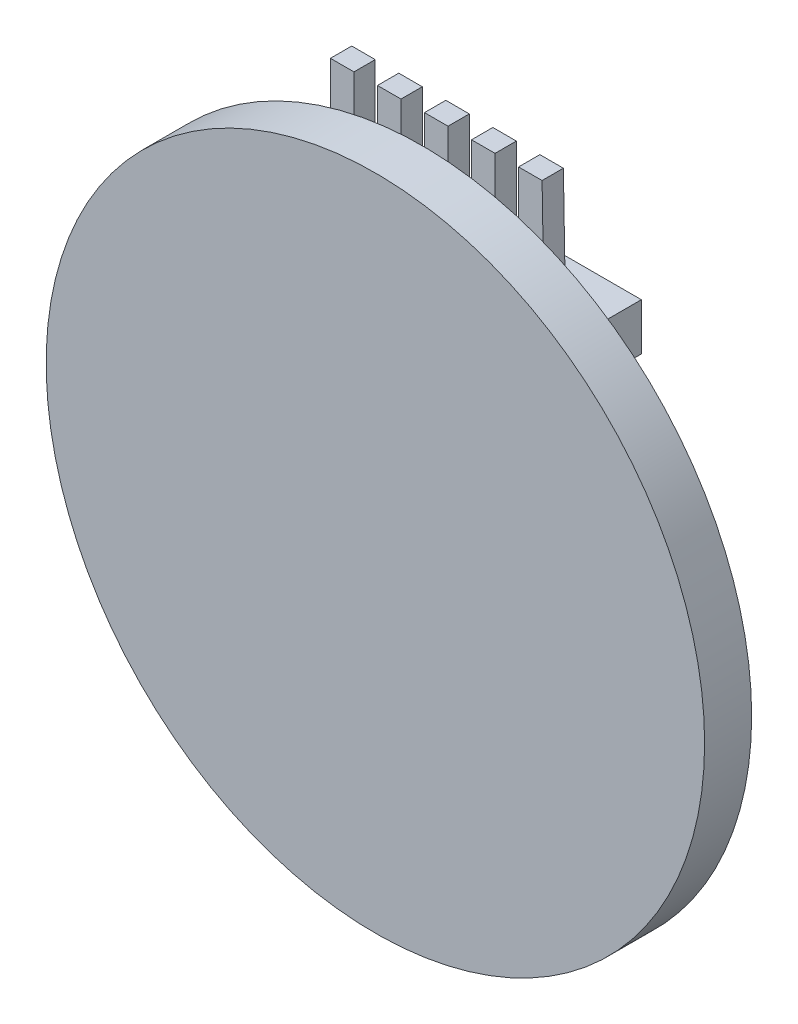
ISO-10303-21;
HEADER;
FILE_DESCRIPTION(('STEP AP214'),'2;1');
FILE_NAME('part.step','',(''),(''),'','','');
FILE_SCHEMA(('AUTOMOTIVE_DESIGN { 1 0 10303 214 1 1 1 1 }'));
ENDSEC;
DATA;
#1=APPLICATION_CONTEXT('core data for automotive mechanical design processes');
#2=APPLICATION_PROTOCOL_DEFINITION('international standard','automotive_design',2000,#1);
#3=PRODUCT_CONTEXT('',#1,'mechanical');
#4=PRODUCT('Part','Part','',(#3));
#5=PRODUCT_RELATED_PRODUCT_CATEGORY('part','',(#4));
#6=PRODUCT_DEFINITION_FORMATION('','',#4);
#7=PRODUCT_DEFINITION_CONTEXT('part definition',#1,'design');
#8=PRODUCT_DEFINITION('design','',#6,#7);
#9=PRODUCT_DEFINITION_SHAPE('','',#8);
#10=(LENGTH_UNIT() NAMED_UNIT(*) SI_UNIT(.MILLI.,.METRE.));
#11=(NAMED_UNIT(*) PLANE_ANGLE_UNIT() SI_UNIT($,.RADIAN.));
#12=(NAMED_UNIT(*) SI_UNIT($,.STERADIAN.) SOLID_ANGLE_UNIT());
#13=UNCERTAINTY_MEASURE_WITH_UNIT(LENGTH_MEASURE(1.E-05),#10,'distance_accuracy_value','');
#14=(GEOMETRIC_REPRESENTATION_CONTEXT(3) GLOBAL_UNCERTAINTY_ASSIGNED_CONTEXT((#13)) GLOBAL_UNIT_ASSIGNED_CONTEXT((#10,
#11,#12)) REPRESENTATION_CONTEXT('',''));
#15=CARTESIAN_POINT('',(0.,0.,0.));
#16=DIRECTION('',(0.,0.,1.));
#17=DIRECTION('',(1.,0.,0.));
#18=AXIS2_PLACEMENT_3D('',#15,#16,#17);
#19=CARTESIAN_POINT('',(2.6546441065011,4.49293382569431,-2.));
#20=DIRECTION('',(0.,-1.,0.));
#21=DIRECTION('',(0.,0.,-1.));
#22=AXIS2_PLACEMENT_3D('',#19,#20,#21);
#23=PLANE('',#22);
#24=DIRECTION('',(0.,0.,-1.));
#25=VECTOR('',#24,1.);
#26=CARTESIAN_POINT('',(-0.595355893498902,4.49293382569431,-0.139471022905013));
#27=LINE('',#26,#25);
#28=CARTESIAN_POINT('',(-0.595355893498902,4.49293382569431,-0.139471022905013));
#29=VERTEX_POINT('',#28);
#30=CARTESIAN_POINT('',(-0.595355893498902,4.49293382569431,-0.592294565038287));
#31=VERTEX_POINT('',#30);
#32=EDGE_CURVE('E190',#29,#31,#27,.T.);
#33=ORIENTED_EDGE('',*,*,#32,.F.);
#34=DIRECTION('',(1.,0.,0.));
#35=VECTOR('',#34,1.);
#36=CARTESIAN_POINT('',(-0.595355893498902,4.49293382569431,-0.139471022905013));
#37=LINE('',#36,#35);
#38=CARTESIAN_POINT('',(-1.0953558934989,4.49293382569431,-0.139471022905013));
#39=VERTEX_POINT('',#38);
#40=EDGE_CURVE('E195',#39,#29,#37,.T.);
#41=ORIENTED_EDGE('',*,*,#40,.F.);
#42=DIRECTION('',(0.,0.,1.));
#43=VECTOR('',#42,1.);
#44=CARTESIAN_POINT('',(-1.0953558934989,4.49293382569431,-0.139471022905013));
#45=LINE('',#44,#43);
#46=CARTESIAN_POINT('',(-1.0953558934989,4.49293382569431,-0.592294565038287));
#47=VERTEX_POINT('',#46);
#48=EDGE_CURVE('E210',#47,#39,#45,.T.);
#49=ORIENTED_EDGE('',*,*,#48,.F.);
#50=DIRECTION('',(-1.,0.,0.));
#51=VECTOR('',#50,1.);
#52=CARTESIAN_POINT('',(-0.595355893498902,4.49293382569431,-0.592294565038287));
#53=LINE('',#52,#51);
#54=EDGE_CURVE('E207',#31,#47,#53,.T.);
#55=ORIENTED_EDGE('',*,*,#54,.F.);
#56=EDGE_LOOP('',(#33,#41,#49,#55));
#57=FACE_BOUND('',#56,.T.);
#58=DIRECTION('',(0.,0.,-1.));
#59=VECTOR('',#58,1.);
#60=CARTESIAN_POINT('',(1.4046441065011,4.49293382569431,-0.139471022905013));
#61=LINE('',#60,#59);
#62=CARTESIAN_POINT('',(1.4046441065011,4.49293382569431,-0.139471022905013));
#63=VERTEX_POINT('',#62);
#64=CARTESIAN_POINT('',(1.4046441065011,4.49293382569431,-0.592294565038287));
#65=VERTEX_POINT('',#64);
#66=EDGE_CURVE('E262',#63,#65,#61,.T.);
#67=ORIENTED_EDGE('',*,*,#66,.F.);
#68=DIRECTION('',(1.,0.,0.));
#69=VECTOR('',#68,1.);
#70=CARTESIAN_POINT('',(1.4046441065011,4.49293382569431,-0.139471022905013));
#71=LINE('',#70,#69);
#72=CARTESIAN_POINT('',(0.904644106501098,4.49293382569431,-0.139471022905013));
#73=VERTEX_POINT('',#72);
#74=EDGE_CURVE('E266',#73,#63,#71,.T.);
#75=ORIENTED_EDGE('',*,*,#74,.F.);
#76=DIRECTION('',(0.,0.,1.));
#77=VECTOR('',#76,1.);
#78=CARTESIAN_POINT('',(0.904644106501098,4.49293382569431,-0.139471022905013));
#79=LINE('',#78,#77);
#80=CARTESIAN_POINT('',(0.904644106501098,4.49293382569431,-0.592294565038287));
#81=VERTEX_POINT('',#80);
#82=EDGE_CURVE('E278',#81,#73,#79,.T.);
#83=ORIENTED_EDGE('',*,*,#82,.F.);
#84=DIRECTION('',(-1.,0.,0.));
#85=VECTOR('',#84,1.);
#86=CARTESIAN_POINT('',(1.4046441065011,4.49293382569431,-0.592294565038287));
#87=LINE('',#86,#85);
#88=EDGE_CURVE('E275',#65,#81,#87,.T.);
#89=ORIENTED_EDGE('',*,*,#88,.F.);
#90=EDGE_LOOP('',(#67,#75,#83,#89));
#91=FACE_BOUND('',#90,.T.);
#92=DIRECTION('',(1.,0.,0.));
#93=VECTOR('',#92,1.);
#94=CARTESIAN_POINT('',(2.6546441065011,4.49293382569431,0.));
#95=LINE('',#94,#93);
#96=CARTESIAN_POINT('',(-2.3453558934989,4.49293382569431,0.));
#97=VERTEX_POINT('',#96);
#98=CARTESIAN_POINT('',(2.6546441065011,4.49293382569431,0.));
#99=VERTEX_POINT('',#98);
#100=EDGE_CURVE('E322',#97,#99,#95,.T.);
#101=ORIENTED_EDGE('',*,*,#100,.T.);
#102=DIRECTION('',(0.,0.,1.));
#103=VECTOR('',#102,1.);
#104=CARTESIAN_POINT('',(2.6546441065011,4.49293382569431,-2.));
#105=LINE('',#104,#103);
#106=CARTESIAN_POINT('',(2.6546441065011,4.49293382569431,-2.));
#107=VERTEX_POINT('',#106);
#108=EDGE_CURVE('E328',#107,#99,#105,.T.);
#109=ORIENTED_EDGE('',*,*,#108,.F.);
#110=DIRECTION('',(1.,0.,0.));
#111=VECTOR('',#110,1.);
#112=CARTESIAN_POINT('',(2.6546441065011,4.49293382569431,-2.));
#113=LINE('',#112,#111);
#114=CARTESIAN_POINT('',(-2.3453558934989,4.49293382569431,-2.));
#115=VERTEX_POINT('',#114);
#116=EDGE_CURVE('E326',#115,#107,#113,.T.);
#117=ORIENTED_EDGE('',*,*,#116,.F.);
#118=DIRECTION('',(0.,0.,1.));
#119=VECTOR('',#118,1.);
#120=CARTESIAN_POINT('',(-2.3453558934989,4.49293382569431,-2.));
#121=LINE('',#120,#119);
#122=EDGE_CURVE('E342',#115,#97,#121,.T.);
#123=ORIENTED_EDGE('',*,*,#122,.T.);
#124=EDGE_LOOP('',(#101,#109,#117,#123));
#125=FACE_BOUND('',#124,.T.);
#126=DIRECTION('',(0.,0.,1.));
#127=VECTOR('',#126,1.);
#128=CARTESIAN_POINT('',(2.45700930128575,4.49293382569431,-2.));
#129=LINE('',#128,#127);
#130=CARTESIAN_POINT('',(2.45700930128575,4.49293382569431,-0.139471022905013));
#131=VERTEX_POINT('',#130);
#132=CARTESIAN_POINT('',(2.45700930128575,4.49293382569431,-0.592294565038287));
#133=VERTEX_POINT('',#132);
#134=EDGE_CURVE('E69',#131,#133,#129,.F.);
#135=ORIENTED_EDGE('',*,*,#134,.F.);
#136=DIRECTION('',(1.,0.,0.));
#137=VECTOR('',#136,1.);
#138=CARTESIAN_POINT('',(2.4046441065011,4.49293382569431,-0.139471022905013));
#139=LINE('',#138,#137);
#140=CARTESIAN_POINT('',(1.9046441065011,4.49293382569431,-0.139471022905013));
#141=VERTEX_POINT('',#140);
#142=EDGE_CURVE('E298',#141,#131,#139,.T.);
#143=ORIENTED_EDGE('',*,*,#142,.F.);
#144=DIRECTION('',(0.,0.,1.));
#145=VECTOR('',#144,1.);
#146=CARTESIAN_POINT('',(1.9046441065011,4.49293382569431,-0.139471022905013));
#147=LINE('',#146,#145);
#148=CARTESIAN_POINT('',(1.9046441065011,4.49293382569431,-0.592294565038287));
#149=VERTEX_POINT('',#148);
#150=EDGE_CURVE('E308',#149,#141,#147,.T.);
#151=ORIENTED_EDGE('',*,*,#150,.F.);
#152=DIRECTION('',(-1.,0.,0.));
#153=VECTOR('',#152,1.);
#154=CARTESIAN_POINT('',(2.4046441065011,4.49293382569431,-0.592294565038287));
#155=LINE('',#154,#153);
#156=EDGE_CURVE('E305',#133,#149,#155,.T.);
#157=ORIENTED_EDGE('',*,*,#156,.F.);
#158=EDGE_LOOP('',(#135,#143,#151,#157));
#159=FACE_BOUND('',#158,.T.);
#160=DIRECTION('',(0.,0.,-1.));
#161=VECTOR('',#160,1.);
#162=CARTESIAN_POINT('',(0.404644106501098,4.49293382569431,-0.139471022905013));
#163=LINE('',#162,#161);
#164=CARTESIAN_POINT('',(0.404644106501098,4.49293382569431,-0.139471022905013));
#165=VERTEX_POINT('',#164);
#166=CARTESIAN_POINT('',(0.404644106501098,4.49293382569431,-0.592294565038287));
#167=VERTEX_POINT('',#166);
#168=EDGE_CURVE('E226',#165,#167,#163,.T.);
#169=ORIENTED_EDGE('',*,*,#168,.F.);
#170=DIRECTION('',(1.,0.,0.));
#171=VECTOR('',#170,1.);
#172=CARTESIAN_POINT('',(0.404644106501098,4.49293382569431,-0.139471022905013));
#173=LINE('',#172,#171);
#174=CARTESIAN_POINT('',(-0.0953558934989021,4.49293382569431,-0.139471022905013));
#175=VERTEX_POINT('',#174);
#176=EDGE_CURVE('E231',#175,#165,#173,.T.);
#177=ORIENTED_EDGE('',*,*,#176,.F.);
#178=DIRECTION('',(0.,0.,1.));
#179=VECTOR('',#178,1.);
#180=CARTESIAN_POINT('',(-0.0953558934989021,4.49293382569431,-0.139471022905013));
#181=LINE('',#180,#179);
#182=CARTESIAN_POINT('',(-0.0953558934989021,4.49293382569431,-0.592294565038287));
#183=VERTEX_POINT('',#182);
#184=EDGE_CURVE('E246',#183,#175,#181,.T.);
#185=ORIENTED_EDGE('',*,*,#184,.F.);
#186=DIRECTION('',(-1.,0.,0.));
#187=VECTOR('',#186,1.);
#188=CARTESIAN_POINT('',(0.404644106501098,4.49293382569431,-0.592294565038287));
#189=LINE('',#188,#187);
#190=EDGE_CURVE('E243',#167,#183,#189,.T.);
#191=ORIENTED_EDGE('',*,*,#190,.F.);
#192=EDGE_LOOP('',(#169,#177,#185,#191));
#193=FACE_BOUND('',#192,.T.);
#194=DIRECTION('',(0.,0.,-1.));
#195=VECTOR('',#194,1.);
#196=CARTESIAN_POINT('',(-1.5953558934989,4.49293382569431,-0.139471022905013));
#197=LINE('',#196,#195);
#198=CARTESIAN_POINT('',(-1.5953558934989,4.49293382569431,-0.139471022905013));
#199=VERTEX_POINT('',#198);
#200=CARTESIAN_POINT('',(-1.5953558934989,4.49293382569431,-0.592294565038287));
#201=VERTEX_POINT('',#200);
#202=EDGE_CURVE('E162',#199,#201,#197,.T.);
#203=ORIENTED_EDGE('',*,*,#202,.F.);
#204=DIRECTION('',(1.,0.,0.));
#205=VECTOR('',#204,1.);
#206=CARTESIAN_POINT('',(-1.5953558934989,4.49293382569431,-0.139471022905013));
#207=LINE('',#206,#205);
#208=CARTESIAN_POINT('',(-2.0953558934989,4.49293382569431,-0.139471022905013));
#209=VERTEX_POINT('',#208);
#210=EDGE_CURVE('E157',#209,#199,#207,.T.);
#211=ORIENTED_EDGE('',*,*,#210,.F.);
#212=DIRECTION('',(0.,0.,1.));
#213=VECTOR('',#212,1.);
#214=CARTESIAN_POINT('',(-2.0953558934989,4.49293382569431,-0.139471022905013));
#215=LINE('',#214,#213);
#216=CARTESIAN_POINT('',(-2.0953558934989,4.49293382569431,-0.592294565038287));
#217=VERTEX_POINT('',#216);
#218=EDGE_CURVE('E159',#217,#209,#215,.T.);
#219=ORIENTED_EDGE('',*,*,#218,.F.);
#220=DIRECTION('',(-1.,0.,0.));
#221=VECTOR('',#220,1.);
#222=CARTESIAN_POINT('',(-1.5953558934989,4.49293382569431,-0.592294565038287));
#223=LINE('',#222,#221);
#224=EDGE_CURVE('E56',#201,#217,#223,.T.);
#225=ORIENTED_EDGE('',*,*,#224,.F.);
#226=EDGE_LOOP('',(#203,#211,#219,#225));
#227=FACE_BOUND('',#226,.T.);
#228=ADVANCED_FACE('F37',(#57,#91,#125,#159,#193,#227),#23,.F.);
#229=CARTESIAN_POINT('',(0.,0.,0.));
#230=DIRECTION('',(0.,0.,1.));
#231=DIRECTION('',(1.,0.,0.));
#232=AXIS2_PLACEMENT_3D('',#229,#230,#231);
#233=PLANE('',#232);
#234=CARTESIAN_POINT('',(0.,0.,0.));
#235=DIRECTION('',(0.,0.,1.));
#236=DIRECTION('',(1.,0.,0.));
#237=AXIS2_PLACEMENT_3D('',#234,#235,#236);
#238=CIRCLE('',#237,7.);
#239=CARTESIAN_POINT('',(7.,0.,0.));
#240=VERTEX_POINT('',#239);
#241=EDGE_CURVE('E47',#240,#240,#238,.T.);
#242=ORIENTED_EDGE('',*,*,#241,.F.);
#243=EDGE_LOOP('',(#242));
#244=FACE_BOUND('',#243,.T.);
#245=DIRECTION('',(0.,-1.,0.));
#246=VECTOR('',#245,1.);
#247=CARTESIAN_POINT('',(2.6546441065011,4.49293382569431,0.));
#248=LINE('',#247,#246);
#249=CARTESIAN_POINT('',(2.6546441065011,3.49293382569431,0.));
#250=VERTEX_POINT('',#249);
#251=EDGE_CURVE('E329',#99,#250,#248,.T.);
#252=ORIENTED_EDGE('',*,*,#251,.F.);
#253=ORIENTED_EDGE('',*,*,#100,.F.);
#254=DIRECTION('',(0.,1.,0.));
#255=VECTOR('',#254,1.);
#256=CARTESIAN_POINT('',(-2.3453558934989,4.49293382569431,0.));
#257=LINE('',#256,#255);
#258=CARTESIAN_POINT('',(-2.3453558934989,3.49293382569431,0.));
#259=VERTEX_POINT('',#258);
#260=EDGE_CURVE('E335',#259,#97,#257,.T.);
#261=ORIENTED_EDGE('',*,*,#260,.F.);
#262=DIRECTION('',(-1.,0.,0.));
#263=VECTOR('',#262,1.);
#264=CARTESIAN_POINT('',(2.6546441065011,3.49293382569431,0.));
#265=LINE('',#264,#263);
#266=EDGE_CURVE('E332',#250,#259,#265,.T.);
#267=ORIENTED_EDGE('',*,*,#266,.F.);
#268=EDGE_LOOP('',(#252,#253,#261,#267));
#269=FACE_BOUND('',#268,.T.);
#270=ADVANCED_FACE('F384',(#244,#269),#233,.F.);
#271=CARTESIAN_POINT('',(0.,0.,1.));
#272=DIRECTION('',(0.,0.,-1.));
#273=DIRECTION('',(-1.,0.,0.));
#274=AXIS2_PLACEMENT_3D('',#271,#272,#273);
#275=CYLINDRICAL_SURFACE('',#274,7.);
#276=CARTESIAN_POINT('',(0.,0.,1.));
#277=DIRECTION('',(0.,0.,1.));
#278=DIRECTION('',(1.,0.,0.));
#279=AXIS2_PLACEMENT_3D('',#276,#277,#278);
#280=CIRCLE('',#279,7.);
#281=CARTESIAN_POINT('',(7.,0.,1.));
#282=VERTEX_POINT('',#281);
#283=EDGE_CURVE('E11',#282,#282,#280,.T.);
#284=ORIENTED_EDGE('',*,*,#283,.F.);
#285=EDGE_LOOP('',(#284));
#286=FACE_BOUND('',#285,.T.);
#287=ORIENTED_EDGE('',*,*,#241,.T.);
#288=EDGE_LOOP('',(#287));
#289=FACE_BOUND('',#288,.T.);
#290=ADVANCED_FACE('F390',(#286,#289),#275,.T.);
#291=CARTESIAN_POINT('',(0.,0.,1.));
#292=DIRECTION('',(0.,0.,1.));
#293=DIRECTION('',(1.,0.,0.));
#294=AXIS2_PLACEMENT_3D('',#291,#292,#293);
#295=PLANE('',#294);
#296=ORIENTED_EDGE('',*,*,#283,.T.);
#297=EDGE_LOOP('',(#296));
#298=FACE_BOUND('',#297,.T.);
#299=ADVANCED_FACE('F410',(#298),#295,.T.);
#300=CARTESIAN_POINT('',(2.6546441065011,4.49293382569431,-2.));
#301=DIRECTION('',(-1.,0.,0.));
#302=DIRECTION('',(0.,0.,1.));
#303=AXIS2_PLACEMENT_3D('',#300,#301,#302);
#304=PLANE('',#303);
#305=ORIENTED_EDGE('',*,*,#251,.T.);
#306=DIRECTION('',(0.,0.,1.));
#307=VECTOR('',#306,1.);
#308=CARTESIAN_POINT('',(2.6546441065011,3.49293382569431,-2.));
#309=LINE('',#308,#307);
#310=CARTESIAN_POINT('',(2.6546441065011,3.49293382569431,-2.));
#311=VERTEX_POINT('',#310);
#312=EDGE_CURVE('E348',#311,#250,#309,.T.);
#313=ORIENTED_EDGE('',*,*,#312,.F.);
#314=DIRECTION('',(0.,-1.,0.));
#315=VECTOR('',#314,1.);
#316=CARTESIAN_POINT('',(2.6546441065011,4.49293382569431,-2.));
#317=LINE('',#316,#315);
#318=EDGE_CURVE('E318',#107,#311,#317,.T.);
#319=ORIENTED_EDGE('',*,*,#318,.F.);
#320=ORIENTED_EDGE('',*,*,#108,.T.);
#321=EDGE_LOOP('',(#305,#313,#319,#320));
#322=FACE_BOUND('',#321,.T.);
#323=ADVANCED_FACE('F406',(#322),#304,.F.);
#324=CARTESIAN_POINT('',(2.6546441065011,3.49293382569431,-2.));
#325=DIRECTION('',(0.,1.,0.));
#326=DIRECTION('',(0.,0.,1.));
#327=AXIS2_PLACEMENT_3D('',#324,#325,#326);
#328=PLANE('',#327);
#329=ORIENTED_EDGE('',*,*,#266,.T.);
#330=DIRECTION('',(0.,0.,1.));
#331=VECTOR('',#330,1.);
#332=CARTESIAN_POINT('',(-2.3453558934989,3.49293382569431,-2.));
#333=LINE('',#332,#331);
#334=CARTESIAN_POINT('',(-2.3453558934989,3.49293382569431,-2.));
#335=VERTEX_POINT('',#334);
#336=EDGE_CURVE('E345',#335,#259,#333,.T.);
#337=ORIENTED_EDGE('',*,*,#336,.F.);
#338=DIRECTION('',(-1.,0.,0.));
#339=VECTOR('',#338,1.);
#340=CARTESIAN_POINT('',(2.6546441065011,3.49293382569431,-2.));
#341=LINE('',#340,#339);
#342=EDGE_CURVE('E321',#311,#335,#341,.T.);
#343=ORIENTED_EDGE('',*,*,#342,.F.);
#344=ORIENTED_EDGE('',*,*,#312,.T.);
#345=EDGE_LOOP('',(#329,#337,#343,#344));
#346=FACE_BOUND('',#345,.T.);
#347=ADVANCED_FACE('F402',(#346),#328,.F.);
#348=CARTESIAN_POINT('',(-2.3453558934989,4.49293382569431,-2.));
#349=DIRECTION('',(1.,0.,0.));
#350=DIRECTION('',(0.,0.,-1.));
#351=AXIS2_PLACEMENT_3D('',#348,#349,#350);
#352=PLANE('',#351);
#353=ORIENTED_EDGE('',*,*,#260,.T.);
#354=ORIENTED_EDGE('',*,*,#122,.F.);
#355=DIRECTION('',(0.,1.,0.));
#356=VECTOR('',#355,1.);
#357=CARTESIAN_POINT('',(-2.3453558934989,4.49293382569431,-2.));
#358=LINE('',#357,#356);
#359=EDGE_CURVE('E324',#335,#115,#358,.T.);
#360=ORIENTED_EDGE('',*,*,#359,.F.);
#361=ORIENTED_EDGE('',*,*,#336,.T.);
#362=EDGE_LOOP('',(#353,#354,#360,#361));
#363=FACE_BOUND('',#362,.T.);
#364=ADVANCED_FACE('F399',(#363),#352,.F.);
#365=CARTESIAN_POINT('',(0.,0.,-2.));
#366=DIRECTION('',(0.,0.,-1.));
#367=DIRECTION('',(-1.,0.,0.));
#368=AXIS2_PLACEMENT_3D('',#365,#366,#367);
#369=PLANE('',#368);
#370=ORIENTED_EDGE('',*,*,#318,.T.);
#371=ORIENTED_EDGE('',*,*,#342,.T.);
#372=ORIENTED_EDGE('',*,*,#359,.T.);
#373=ORIENTED_EDGE('',*,*,#116,.T.);
#374=EDGE_LOOP('',(#370,#371,#372,#373));
#375=FACE_BOUND('',#374,.T.);
#376=ADVANCED_FACE('F397',(#375),#369,.T.);
#377=CARTESIAN_POINT('',(2.4046441065011,7.49293382569431,-0.139471022905013));
#378=DIRECTION('',(0.999847695156391,0.0174524064372835,0.));
#379=DIRECTION('',(-0.0174524064372836,0.999847695156391,0.));
#380=AXIS2_PLACEMENT_3D('',#377,#378,#379);
#381=PLANE('',#380);
#382=ORIENTED_EDGE('',*,*,#134,.T.);
#383=DIRECTION('',(-0.0174524064372836,0.999847695156391,0.));
#384=VECTOR('',#383,1.);
#385=CARTESIAN_POINT('',(2.4046441065011,7.49293382569431,-0.592294565038287));
#386=LINE('',#385,#384);
#387=CARTESIAN_POINT('',(2.4046441065011,7.49293382569431,-0.592294565038287));
#388=VERTEX_POINT('',#387);
#389=EDGE_CURVE('E41',#388,#133,#386,.F.);
#390=ORIENTED_EDGE('',*,*,#389,.F.);
#391=DIRECTION('',(0.,0.,-1.));
#392=VECTOR('',#391,1.);
#393=CARTESIAN_POINT('',(2.4046441065011,7.49293382569431,-0.139471022905013));
#394=LINE('',#393,#392);
#395=CARTESIAN_POINT('',(2.4046441065011,7.49293382569431,-0.139471022905013));
#396=VERTEX_POINT('',#395);
#397=EDGE_CURVE('E294',#396,#388,#394,.T.);
#398=ORIENTED_EDGE('',*,*,#397,.F.);
#399=DIRECTION('',(-0.0174524064372836,0.999847695156391,0.));
#400=VECTOR('',#399,1.);
#401=CARTESIAN_POINT('',(2.4046441065011,7.49293382569431,-0.139471022905013));
#402=LINE('',#401,#400);
#403=EDGE_CURVE('E304',#396,#131,#402,.F.);
#404=ORIENTED_EDGE('',*,*,#403,.T.);
#405=EDGE_LOOP('',(#382,#390,#398,#404));
#406=FACE_BOUND('',#405,.T.);
#407=ADVANCED_FACE('F39',(#406),#381,.T.);
#408=CARTESIAN_POINT('',(2.4046441065011,7.49293382569431,-0.592294565038287));
#409=DIRECTION('',(0.,0.,1.));
#410=DIRECTION('',(1.,0.,0.));
#411=AXIS2_PLACEMENT_3D('',#408,#409,#410);
#412=PLANE('',#411);
#413=ORIENTED_EDGE('',*,*,#156,.T.);
#414=DIRECTION('',(0.,-1.,0.));
#415=VECTOR('',#414,1.);
#416=CARTESIAN_POINT('',(1.9046441065011,7.49293382569431,-0.592294565038287));
#417=LINE('',#416,#415);
#418=CARTESIAN_POINT('',(1.9046441065011,7.49293382569431,-0.592294565038287));
#419=VERTEX_POINT('',#418);
#420=EDGE_CURVE('E315',#419,#149,#417,.T.);
#421=ORIENTED_EDGE('',*,*,#420,.F.);
#422=DIRECTION('',(-1.,0.,0.));
#423=VECTOR('',#422,1.);
#424=CARTESIAN_POINT('',(2.4046441065011,7.49293382569431,-0.592294565038287));
#425=LINE('',#424,#423);
#426=EDGE_CURVE('E297',#388,#419,#425,.T.);
#427=ORIENTED_EDGE('',*,*,#426,.F.);
#428=ORIENTED_EDGE('',*,*,#389,.T.);
#429=EDGE_LOOP('',(#413,#421,#427,#428));
#430=FACE_BOUND('',#429,.T.);
#431=ADVANCED_FACE('F368',(#430),#412,.F.);
#432=CARTESIAN_POINT('',(1.9046441065011,7.49293382569431,-0.139471022905013));
#433=DIRECTION('',(1.,0.,0.));
#434=DIRECTION('',(0.,0.,-1.));
#435=AXIS2_PLACEMENT_3D('',#432,#433,#434);
#436=PLANE('',#435);
#437=ORIENTED_EDGE('',*,*,#150,.T.);
#438=DIRECTION('',(0.,-1.,0.));
#439=VECTOR('',#438,1.);
#440=CARTESIAN_POINT('',(1.9046441065011,7.49293382569431,-0.139471022905013));
#441=LINE('',#440,#439);
#442=CARTESIAN_POINT('',(1.9046441065011,7.49293382569431,-0.139471022905013));
#443=VERTEX_POINT('',#442);
#444=EDGE_CURVE('E312',#443,#141,#441,.T.);
#445=ORIENTED_EDGE('',*,*,#444,.F.);
#446=DIRECTION('',(0.,0.,1.));
#447=VECTOR('',#446,1.);
#448=CARTESIAN_POINT('',(1.9046441065011,7.49293382569431,-0.139471022905013));
#449=LINE('',#448,#447);
#450=EDGE_CURVE('E300',#419,#443,#449,.T.);
#451=ORIENTED_EDGE('',*,*,#450,.F.);
#452=ORIENTED_EDGE('',*,*,#420,.T.);
#453=EDGE_LOOP('',(#437,#445,#451,#452));
#454=FACE_BOUND('',#453,.T.);
#455=ADVANCED_FACE('F364',(#454),#436,.F.);
#456=CARTESIAN_POINT('',(2.4046441065011,7.49293382569431,-0.139471022905013));
#457=DIRECTION('',(0.,0.,-1.));
#458=DIRECTION('',(-1.,0.,0.));
#459=AXIS2_PLACEMENT_3D('',#456,#457,#458);
#460=PLANE('',#459);
#461=ORIENTED_EDGE('',*,*,#142,.T.);
#462=ORIENTED_EDGE('',*,*,#403,.F.);
#463=DIRECTION('',(1.,0.,0.));
#464=VECTOR('',#463,1.);
#465=CARTESIAN_POINT('',(2.4046441065011,7.49293382569431,-0.139471022905013));
#466=LINE('',#465,#464);
#467=EDGE_CURVE('E302',#443,#396,#466,.T.);
#468=ORIENTED_EDGE('',*,*,#467,.F.);
#469=ORIENTED_EDGE('',*,*,#444,.T.);
#470=EDGE_LOOP('',(#461,#462,#468,#469));
#471=FACE_BOUND('',#470,.T.);
#472=ADVANCED_FACE('F360',(#471),#460,.F.);
#473=CARTESIAN_POINT('',(0.,7.49293382569431,0.));
#474=DIRECTION('',(0.,1.,0.));
#475=DIRECTION('',(0.,0.,1.));
#476=AXIS2_PLACEMENT_3D('',#473,#474,#475);
#477=PLANE('',#476);
#478=ORIENTED_EDGE('',*,*,#397,.T.);
#479=ORIENTED_EDGE('',*,*,#426,.T.);
#480=ORIENTED_EDGE('',*,*,#450,.T.);
#481=ORIENTED_EDGE('',*,*,#467,.T.);
#482=EDGE_LOOP('',(#478,#479,#480,#481));
#483=FACE_BOUND('',#482,.T.);
#484=ADVANCED_FACE('F371',(#483),#477,.T.);
#485=CARTESIAN_POINT('',(1.4046441065011,7.49293382569431,-0.139471022905013));
#486=DIRECTION('',(-1.,0.,0.));
#487=DIRECTION('',(0.,0.,1.));
#488=AXIS2_PLACEMENT_3D('',#485,#486,#487);
#489=PLANE('',#488);
#490=ORIENTED_EDGE('',*,*,#66,.T.);
#491=DIRECTION('',(0.,-1.,0.));
#492=VECTOR('',#491,1.);
#493=CARTESIAN_POINT('',(1.4046441065011,7.49293382569431,-0.592294565038287));
#494=LINE('',#493,#492);
#495=CARTESIAN_POINT('',(1.4046441065011,7.49293382569431,-0.592294565038287));
#496=VERTEX_POINT('',#495);
#497=EDGE_CURVE('E291',#496,#65,#494,.T.);
#498=ORIENTED_EDGE('',*,*,#497,.F.);
#499=DIRECTION('',(0.,0.,-1.));
#500=VECTOR('',#499,1.);
#501=CARTESIAN_POINT('',(1.4046441065011,7.49293382569431,-0.139471022905013));
#502=LINE('',#501,#500);
#503=CARTESIAN_POINT('',(1.4046441065011,7.49293382569431,-0.139471022905013));
#504=VERTEX_POINT('',#503);
#505=EDGE_CURVE('E263',#504,#496,#502,.T.);
#506=ORIENTED_EDGE('',*,*,#505,.F.);
#507=DIRECTION('',(0.,-1.,0.));
#508=VECTOR('',#507,1.);
#509=CARTESIAN_POINT('',(1.4046441065011,7.49293382569431,-0.139471022905013));
#510=LINE('',#509,#508);
#511=EDGE_CURVE('E272',#504,#63,#510,.T.);
#512=ORIENTED_EDGE('',*,*,#511,.T.);
#513=EDGE_LOOP('',(#490,#498,#506,#512));
#514=FACE_BOUND('',#513,.T.);
#515=ADVANCED_FACE('F373',(#514),#489,.F.);
#516=CARTESIAN_POINT('',(1.4046441065011,7.49293382569431,-0.592294565038287));
#517=DIRECTION('',(0.,0.,1.));
#518=DIRECTION('',(1.,0.,0.));
#519=AXIS2_PLACEMENT_3D('',#516,#517,#518);
#520=PLANE('',#519);
#521=ORIENTED_EDGE('',*,*,#88,.T.);
#522=DIRECTION('',(0.,-1.,0.));
#523=VECTOR('',#522,1.);
#524=CARTESIAN_POINT('',(0.904644106501098,7.49293382569431,-0.592294565038287));
#525=LINE('',#524,#523);
#526=CARTESIAN_POINT('',(0.904644106501098,7.49293382569431,-0.592294565038287));
#527=VERTEX_POINT('',#526);
#528=EDGE_CURVE('E288',#527,#81,#525,.T.);
#529=ORIENTED_EDGE('',*,*,#528,.F.);
#530=DIRECTION('',(-1.,0.,0.));
#531=VECTOR('',#530,1.);
#532=CARTESIAN_POINT('',(1.4046441065011,7.49293382569431,-0.592294565038287));
#533=LINE('',#532,#531);
#534=EDGE_CURVE('E265',#496,#527,#533,.T.);
#535=ORIENTED_EDGE('',*,*,#534,.F.);
#536=ORIENTED_EDGE('',*,*,#497,.T.);
#537=EDGE_LOOP('',(#521,#529,#535,#536));
#538=FACE_BOUND('',#537,.T.);
#539=ADVANCED_FACE('F379',(#538),#520,.F.);
#540=CARTESIAN_POINT('',(0.904644106501098,7.49293382569431,-0.139471022905013));
#541=DIRECTION('',(1.,0.,0.));
#542=DIRECTION('',(0.,0.,-1.));
#543=AXIS2_PLACEMENT_3D('',#540,#541,#542);
#544=PLANE('',#543);
#545=ORIENTED_EDGE('',*,*,#82,.T.);
#546=DIRECTION('',(0.,-1.,0.));
#547=VECTOR('',#546,1.);
#548=CARTESIAN_POINT('',(0.904644106501098,7.49293382569431,-0.139471022905013));
#549=LINE('',#548,#547);
#550=CARTESIAN_POINT('',(0.904644106501098,7.49293382569431,-0.139471022905013));
#551=VERTEX_POINT('',#550);
#552=EDGE_CURVE('E285',#551,#73,#549,.T.);
#553=ORIENTED_EDGE('',*,*,#552,.F.);
#554=DIRECTION('',(0.,0.,1.));
#555=VECTOR('',#554,1.);
#556=CARTESIAN_POINT('',(0.904644106501098,7.49293382569431,-0.139471022905013));
#557=LINE('',#556,#555);
#558=EDGE_CURVE('E269',#527,#551,#557,.T.);
#559=ORIENTED_EDGE('',*,*,#558,.F.);
#560=ORIENTED_EDGE('',*,*,#528,.T.);
#561=EDGE_LOOP('',(#545,#553,#559,#560));
#562=FACE_BOUND('',#561,.T.);
#563=ADVANCED_FACE('F627',(#562),#544,.F.);
#564=CARTESIAN_POINT('',(1.4046441065011,7.49293382569431,-0.139471022905013));
#565=DIRECTION('',(0.,0.,-1.));
#566=DIRECTION('',(-1.,0.,0.));
#567=AXIS2_PLACEMENT_3D('',#564,#565,#566);
#568=PLANE('',#567);
#569=ORIENTED_EDGE('',*,*,#74,.T.);
#570=ORIENTED_EDGE('',*,*,#511,.F.);
#571=DIRECTION('',(1.,0.,0.));
#572=VECTOR('',#571,1.);
#573=CARTESIAN_POINT('',(1.4046441065011,7.49293382569431,-0.139471022905013));
#574=LINE('',#573,#572);
#575=EDGE_CURVE('E81',#551,#504,#574,.T.);
#576=ORIENTED_EDGE('',*,*,#575,.F.);
#577=ORIENTED_EDGE('',*,*,#552,.T.);
#578=EDGE_LOOP('',(#569,#570,#576,#577));
#579=FACE_BOUND('',#578,.T.);
#580=ADVANCED_FACE('F618',(#579),#568,.F.);
#581=CARTESIAN_POINT('',(0.,7.49293382569431,0.));
#582=DIRECTION('',(0.,1.,0.));
#583=DIRECTION('',(0.,0.,1.));
#584=AXIS2_PLACEMENT_3D('',#581,#582,#583);
#585=PLANE('',#584);
#586=ORIENTED_EDGE('',*,*,#505,.T.);
#587=ORIENTED_EDGE('',*,*,#534,.T.);
#588=ORIENTED_EDGE('',*,*,#558,.T.);
#589=ORIENTED_EDGE('',*,*,#575,.T.);
#590=EDGE_LOOP('',(#586,#587,#588,#589));
#591=FACE_BOUND('',#590,.T.);
#592=ADVANCED_FACE('F608',(#591),#585,.T.);
#593=CARTESIAN_POINT('',(0.404644106501098,7.49293382569431,-0.139471022905013));
#594=DIRECTION('',(-1.,0.,0.));
#595=DIRECTION('',(0.,0.,1.));
#596=AXIS2_PLACEMENT_3D('',#593,#594,#595);
#597=PLANE('',#596);
#598=ORIENTED_EDGE('',*,*,#168,.T.);
#599=DIRECTION('',(0.,-1.,0.));
#600=VECTOR('',#599,1.);
#601=CARTESIAN_POINT('',(0.404644106501098,7.49293382569431,-0.592294565038287));
#602=LINE('',#601,#600);
#603=CARTESIAN_POINT('',(0.404644106501098,7.49293382569431,-0.592294565038287));
#604=VERTEX_POINT('',#603);
#605=EDGE_CURVE('E259',#604,#167,#602,.T.);
#606=ORIENTED_EDGE('',*,*,#605,.F.);
#607=DIRECTION('',(0.,0.,-1.));
#608=VECTOR('',#607,1.);
#609=CARTESIAN_POINT('',(0.404644106501098,7.49293382569431,-0.139471022905013));
#610=LINE('',#609,#608);
#611=CARTESIAN_POINT('',(0.404644106501098,7.49293382569431,-0.139471022905013));
#612=VERTEX_POINT('',#611);
#613=EDGE_CURVE('E227',#612,#604,#610,.T.);
#614=ORIENTED_EDGE('',*,*,#613,.F.);
#615=DIRECTION('',(0.,-1.,0.));
#616=VECTOR('',#615,1.);
#617=CARTESIAN_POINT('',(0.404644106501098,7.49293382569431,-0.139471022905013));
#618=LINE('',#617,#616);
#619=EDGE_CURVE('E240',#612,#165,#618,.T.);
#620=ORIENTED_EDGE('',*,*,#619,.T.);
#621=EDGE_LOOP('',(#598,#606,#614,#620));
#622=FACE_BOUND('',#621,.T.);
#623=ADVANCED_FACE('F598',(#622),#597,.F.);
#624=CARTESIAN_POINT('',(0.404644106501098,7.49293382569431,-0.592294565038287));
#625=DIRECTION('',(0.,0.,1.));
#626=DIRECTION('',(1.,0.,0.));
#627=AXIS2_PLACEMENT_3D('',#624,#625,#626);
#628=PLANE('',#627);
#629=ORIENTED_EDGE('',*,*,#190,.T.);
#630=DIRECTION('',(0.,-1.,0.));
#631=VECTOR('',#630,1.);
#632=CARTESIAN_POINT('',(-0.0953558934989021,7.49293382569431,-0.592294565038287));
#633=LINE('',#632,#631);
#634=CARTESIAN_POINT('',(-0.0953558934989021,7.49293382569431,-0.592294565038287));
#635=VERTEX_POINT('',#634);
#636=EDGE_CURVE('E256',#635,#183,#633,.T.);
#637=ORIENTED_EDGE('',*,*,#636,.F.);
#638=DIRECTION('',(-1.,0.,0.));
#639=VECTOR('',#638,1.);
#640=CARTESIAN_POINT('',(0.404644106501098,7.49293382569431,-0.592294565038287));
#641=LINE('',#640,#639);
#642=EDGE_CURVE('E230',#604,#635,#641,.T.);
#643=ORIENTED_EDGE('',*,*,#642,.F.);
#644=ORIENTED_EDGE('',*,*,#605,.T.);
#645=EDGE_LOOP('',(#629,#637,#643,#644));
#646=FACE_BOUND('',#645,.T.);
#647=ADVANCED_FACE('F588',(#646),#628,.F.);
#648=CARTESIAN_POINT('',(-0.0953558934989021,7.49293382569431,-0.139471022905013));
#649=DIRECTION('',(1.,0.,0.));
#650=DIRECTION('',(0.,0.,-1.));
#651=AXIS2_PLACEMENT_3D('',#648,#649,#650);
#652=PLANE('',#651);
#653=ORIENTED_EDGE('',*,*,#184,.T.);
#654=DIRECTION('',(0.,-1.,0.));
#655=VECTOR('',#654,1.);
#656=CARTESIAN_POINT('',(-0.0953558934989021,7.49293382569431,-0.139471022905013));
#657=LINE('',#656,#655);
#658=CARTESIAN_POINT('',(-0.0953558934989021,7.49293382569431,-0.139471022905013));
#659=VERTEX_POINT('',#658);
#660=EDGE_CURVE('E253',#659,#175,#657,.T.);
#661=ORIENTED_EDGE('',*,*,#660,.F.);
#662=DIRECTION('',(0.,0.,1.));
#663=VECTOR('',#662,1.);
#664=CARTESIAN_POINT('',(-0.0953558934989021,7.49293382569431,-0.139471022905013));
#665=LINE('',#664,#663);
#666=EDGE_CURVE('E234',#635,#659,#665,.T.);
#667=ORIENTED_EDGE('',*,*,#666,.F.);
#668=ORIENTED_EDGE('',*,*,#636,.T.);
#669=EDGE_LOOP('',(#653,#661,#667,#668));
#670=FACE_BOUND('',#669,.T.);
#671=ADVANCED_FACE('F578',(#670),#652,.F.);
#672=CARTESIAN_POINT('',(0.404644106501098,7.49293382569431,-0.139471022905013));
#673=DIRECTION('',(0.,0.,-1.));
#674=DIRECTION('',(-1.,0.,0.));
#675=AXIS2_PLACEMENT_3D('',#672,#673,#674);
#676=PLANE('',#675);
#677=ORIENTED_EDGE('',*,*,#176,.T.);
#678=ORIENTED_EDGE('',*,*,#619,.F.);
#679=DIRECTION('',(1.,0.,0.));
#680=VECTOR('',#679,1.);
#681=CARTESIAN_POINT('',(0.404644106501098,7.49293382569431,-0.139471022905013));
#682=LINE('',#681,#680);
#683=EDGE_CURVE('E237',#659,#612,#682,.T.);
#684=ORIENTED_EDGE('',*,*,#683,.F.);
#685=ORIENTED_EDGE('',*,*,#660,.T.);
#686=EDGE_LOOP('',(#677,#678,#684,#685));
#687=FACE_BOUND('',#686,.T.);
#688=ADVANCED_FACE('F568',(#687),#676,.F.);
#689=CARTESIAN_POINT('',(0.,7.49293382569431,0.));
#690=DIRECTION('',(0.,1.,0.));
#691=DIRECTION('',(0.,0.,1.));
#692=AXIS2_PLACEMENT_3D('',#689,#690,#691);
#693=PLANE('',#692);
#694=ORIENTED_EDGE('',*,*,#613,.T.);
#695=ORIENTED_EDGE('',*,*,#642,.T.);
#696=ORIENTED_EDGE('',*,*,#666,.T.);
#697=ORIENTED_EDGE('',*,*,#683,.T.);
#698=EDGE_LOOP('',(#694,#695,#696,#697));
#699=FACE_BOUND('',#698,.T.);
#700=ADVANCED_FACE('F558',(#699),#693,.T.);
#701=CARTESIAN_POINT('',(-0.595355893498902,7.49293382569431,-0.139471022905013));
#702=DIRECTION('',(-1.,0.,0.));
#703=DIRECTION('',(0.,0.,1.));
#704=AXIS2_PLACEMENT_3D('',#701,#702,#703);
#705=PLANE('',#704);
#706=ORIENTED_EDGE('',*,*,#32,.T.);
#707=DIRECTION('',(0.,-1.,0.));
#708=VECTOR('',#707,1.);
#709=CARTESIAN_POINT('',(-0.595355893498902,7.49293382569431,-0.592294565038287));
#710=LINE('',#709,#708);
#711=CARTESIAN_POINT('',(-0.595355893498902,7.49293382569431,-0.592294565038287));
#712=VERTEX_POINT('',#711);
#713=EDGE_CURVE('E223',#712,#31,#710,.T.);
#714=ORIENTED_EDGE('',*,*,#713,.F.);
#715=DIRECTION('',(0.,0.,-1.));
#716=VECTOR('',#715,1.);
#717=CARTESIAN_POINT('',(-0.595355893498902,7.49293382569431,-0.139471022905013));
#718=LINE('',#717,#716);
#719=CARTESIAN_POINT('',(-0.595355893498902,7.49293382569431,-0.139471022905013));
#720=VERTEX_POINT('',#719);
#721=EDGE_CURVE('E191',#720,#712,#718,.T.);
#722=ORIENTED_EDGE('',*,*,#721,.F.);
#723=DIRECTION('',(0.,-1.,0.));
#724=VECTOR('',#723,1.);
#725=CARTESIAN_POINT('',(-0.595355893498902,7.49293382569431,-0.139471022905013));
#726=LINE('',#725,#724);
#727=EDGE_CURVE('E204',#720,#29,#726,.T.);
#728=ORIENTED_EDGE('',*,*,#727,.T.);
#729=EDGE_LOOP('',(#706,#714,#722,#728));
#730=FACE_BOUND('',#729,.T.);
#731=ADVANCED_FACE('F548',(#730),#705,.F.);
#732=CARTESIAN_POINT('',(-0.595355893498902,7.49293382569431,-0.592294565038287));
#733=DIRECTION('',(0.,0.,1.));
#734=DIRECTION('',(1.,0.,0.));
#735=AXIS2_PLACEMENT_3D('',#732,#733,#734);
#736=PLANE('',#735);
#737=ORIENTED_EDGE('',*,*,#54,.T.);
#738=DIRECTION('',(0.,-1.,0.));
#739=VECTOR('',#738,1.);
#740=CARTESIAN_POINT('',(-1.0953558934989,7.49293382569431,-0.592294565038287));
#741=LINE('',#740,#739);
#742=CARTESIAN_POINT('',(-1.0953558934989,7.49293382569431,-0.592294565038287));
#743=VERTEX_POINT('',#742);
#744=EDGE_CURVE('E220',#743,#47,#741,.T.);
#745=ORIENTED_EDGE('',*,*,#744,.F.);
#746=DIRECTION('',(-1.,0.,0.));
#747=VECTOR('',#746,1.);
#748=CARTESIAN_POINT('',(-0.595355893498902,7.49293382569431,-0.592294565038287));
#749=LINE('',#748,#747);
#750=EDGE_CURVE('E194',#712,#743,#749,.T.);
#751=ORIENTED_EDGE('',*,*,#750,.F.);
#752=ORIENTED_EDGE('',*,*,#713,.T.);
#753=EDGE_LOOP('',(#737,#745,#751,#752));
#754=FACE_BOUND('',#753,.T.);
#755=ADVANCED_FACE('F538',(#754),#736,.F.);
#756=CARTESIAN_POINT('',(-1.0953558934989,7.49293382569431,-0.139471022905013));
#757=DIRECTION('',(1.,0.,0.));
#758=DIRECTION('',(0.,0.,-1.));
#759=AXIS2_PLACEMENT_3D('',#756,#757,#758);
#760=PLANE('',#759);
#761=ORIENTED_EDGE('',*,*,#48,.T.);
#762=DIRECTION('',(0.,-1.,0.));
#763=VECTOR('',#762,1.);
#764=CARTESIAN_POINT('',(-1.0953558934989,7.49293382569431,-0.139471022905013));
#765=LINE('',#764,#763);
#766=CARTESIAN_POINT('',(-1.0953558934989,7.49293382569431,-0.139471022905013));
#767=VERTEX_POINT('',#766);
#768=EDGE_CURVE('E217',#767,#39,#765,.T.);
#769=ORIENTED_EDGE('',*,*,#768,.F.);
#770=DIRECTION('',(0.,0.,1.));
#771=VECTOR('',#770,1.);
#772=CARTESIAN_POINT('',(-1.0953558934989,7.49293382569431,-0.139471022905013));
#773=LINE('',#772,#771);
#774=EDGE_CURVE('E198',#743,#767,#773,.T.);
#775=ORIENTED_EDGE('',*,*,#774,.F.);
#776=ORIENTED_EDGE('',*,*,#744,.T.);
#777=EDGE_LOOP('',(#761,#769,#775,#776));
#778=FACE_BOUND('',#777,.T.);
#779=ADVANCED_FACE('F528',(#778),#760,.F.);
#780=CARTESIAN_POINT('',(-0.595355893498902,7.49293382569431,-0.139471022905013));
#781=DIRECTION('',(0.,0.,-1.));
#782=DIRECTION('',(-1.,0.,0.));
#783=AXIS2_PLACEMENT_3D('',#780,#781,#782);
#784=PLANE('',#783);
#785=ORIENTED_EDGE('',*,*,#40,.T.);
#786=ORIENTED_EDGE('',*,*,#727,.F.);
#787=DIRECTION('',(1.,0.,0.));
#788=VECTOR('',#787,1.);
#789=CARTESIAN_POINT('',(-0.595355893498902,7.49293382569431,-0.139471022905013));
#790=LINE('',#789,#788);
#791=EDGE_CURVE('E201',#767,#720,#790,.T.);
#792=ORIENTED_EDGE('',*,*,#791,.F.);
#793=ORIENTED_EDGE('',*,*,#768,.T.);
#794=EDGE_LOOP('',(#785,#786,#792,#793));
#795=FACE_BOUND('',#794,.T.);
#796=ADVANCED_FACE('F518',(#795),#784,.F.);
#797=CARTESIAN_POINT('',(0.,7.49293382569431,0.));
#798=DIRECTION('',(0.,1.,0.));
#799=DIRECTION('',(0.,0.,1.));
#800=AXIS2_PLACEMENT_3D('',#797,#798,#799);
#801=PLANE('',#800);
#802=ORIENTED_EDGE('',*,*,#721,.T.);
#803=ORIENTED_EDGE('',*,*,#750,.T.);
#804=ORIENTED_EDGE('',*,*,#774,.T.);
#805=ORIENTED_EDGE('',*,*,#791,.T.);
#806=EDGE_LOOP('',(#802,#803,#804,#805));
#807=FACE_BOUND('',#806,.T.);
#808=ADVANCED_FACE('F508',(#807),#801,.T.);
#809=CARTESIAN_POINT('',(-1.5953558934989,7.49293382569431,-0.139471022905013));
#810=DIRECTION('',(-1.,0.,0.));
#811=DIRECTION('',(0.,0.,1.));
#812=AXIS2_PLACEMENT_3D('',#809,#810,#811);
#813=PLANE('',#812);
#814=ORIENTED_EDGE('',*,*,#202,.T.);
#815=DIRECTION('',(0.,-1.,0.));
#816=VECTOR('',#815,1.);
#817=CARTESIAN_POINT('',(-1.5953558934989,7.49293382569431,-0.592294565038287));
#818=LINE('',#817,#816);
#819=CARTESIAN_POINT('',(-1.5953558934989,7.49293382569431,-0.592294565038287));
#820=VERTEX_POINT('',#819);
#821=EDGE_CURVE('E185',#820,#201,#818,.T.);
#822=ORIENTED_EDGE('',*,*,#821,.F.);
#823=DIRECTION('',(0.,0.,-1.));
#824=VECTOR('',#823,1.);
#825=CARTESIAN_POINT('',(-1.5953558934989,7.49293382569431,-0.139471022905013));
#826=LINE('',#825,#824);
#827=CARTESIAN_POINT('',(-1.5953558934989,7.49293382569431,-0.139471022905013));
#828=VERTEX_POINT('',#827);
#829=EDGE_CURVE('E167',#828,#820,#826,.T.);
#830=ORIENTED_EDGE('',*,*,#829,.F.);
#831=DIRECTION('',(0.,-1.,0.));
#832=VECTOR('',#831,1.);
#833=CARTESIAN_POINT('',(-1.5953558934989,7.49293382569431,-0.139471022905013));
#834=LINE('',#833,#832);
#835=EDGE_CURVE('E183',#828,#199,#834,.T.);
#836=ORIENTED_EDGE('',*,*,#835,.T.);
#837=EDGE_LOOP('',(#814,#822,#830,#836));
#838=FACE_BOUND('',#837,.T.);
#839=ADVANCED_FACE('F498',(#838),#813,.F.);
#840=CARTESIAN_POINT('',(-1.5953558934989,7.49293382569431,-0.592294565038287));
#841=DIRECTION('',(0.,0.,1.));
#842=DIRECTION('',(1.,0.,0.));
#843=AXIS2_PLACEMENT_3D('',#840,#841,#842);
#844=PLANE('',#843);
#845=ORIENTED_EDGE('',*,*,#224,.T.);
#846=DIRECTION('',(0.,-1.,0.));
#847=VECTOR('',#846,1.);
#848=CARTESIAN_POINT('',(-2.0953558934989,7.49293382569431,-0.592294565038287));
#849=LINE('',#848,#847);
#850=CARTESIAN_POINT('',(-2.0953558934989,7.49293382569431,-0.592294565038287));
#851=VERTEX_POINT('',#850);
#852=EDGE_CURVE('E178',#851,#217,#849,.T.);
#853=ORIENTED_EDGE('',*,*,#852,.F.);
#854=DIRECTION('',(-1.,0.,0.));
#855=VECTOR('',#854,1.);
#856=CARTESIAN_POINT('',(-1.5953558934989,7.49293382569431,-0.592294565038287));
#857=LINE('',#856,#855);
#858=EDGE_CURVE('E699',#820,#851,#857,.T.);
#859=ORIENTED_EDGE('',*,*,#858,.F.);
#860=ORIENTED_EDGE('',*,*,#821,.T.);
#861=EDGE_LOOP('',(#845,#853,#859,#860));
#862=FACE_BOUND('',#861,.T.);
#863=ADVANCED_FACE('F489',(#862),#844,.F.);
#864=CARTESIAN_POINT('',(-2.0953558934989,7.49293382569431,-0.139471022905013));
#865=DIRECTION('',(1.,0.,0.));
#866=DIRECTION('',(0.,0.,-1.));
#867=AXIS2_PLACEMENT_3D('',#864,#865,#866);
#868=PLANE('',#867);
#869=ORIENTED_EDGE('',*,*,#218,.T.);
#870=DIRECTION('',(0.,-1.,0.));
#871=VECTOR('',#870,1.);
#872=CARTESIAN_POINT('',(-2.0953558934989,7.49293382569431,-0.139471022905013));
#873=LINE('',#872,#871);
#874=CARTESIAN_POINT('',(-2.0953558934989,7.49293382569431,-0.139471022905013));
#875=VERTEX_POINT('',#874);
#876=EDGE_CURVE('E175',#875,#209,#873,.T.);
#877=ORIENTED_EDGE('',*,*,#876,.F.);
#878=DIRECTION('',(0.,0.,1.));
#879=VECTOR('',#878,1.);
#880=CARTESIAN_POINT('',(-2.0953558934989,7.49293382569431,-0.139471022905013));
#881=LINE('',#880,#879);
#882=EDGE_CURVE('E702',#851,#875,#881,.T.);
#883=ORIENTED_EDGE('',*,*,#882,.F.);
#884=ORIENTED_EDGE('',*,*,#852,.T.);
#885=EDGE_LOOP('',(#869,#877,#883,#884));
#886=FACE_BOUND('',#885,.T.);
#887=ADVANCED_FACE('F172',(#886),#868,.F.);
#888=CARTESIAN_POINT('',(-1.5953558934989,7.49293382569431,-0.139471022905013));
#889=DIRECTION('',(0.,0.,-1.));
#890=DIRECTION('',(-1.,0.,0.));
#891=AXIS2_PLACEMENT_3D('',#888,#889,#890);
#892=PLANE('',#891);
#893=ORIENTED_EDGE('',*,*,#210,.T.);
#894=ORIENTED_EDGE('',*,*,#835,.F.);
#895=DIRECTION('',(1.,0.,0.));
#896=VECTOR('',#895,1.);
#897=CARTESIAN_POINT('',(-1.5953558934989,7.49293382569431,-0.139471022905013));
#898=LINE('',#897,#896);
#899=EDGE_CURVE('E182',#875,#828,#898,.T.);
#900=ORIENTED_EDGE('',*,*,#899,.F.);
#901=ORIENTED_EDGE('',*,*,#876,.T.);
#902=EDGE_LOOP('',(#893,#894,#900,#901));
#903=FACE_BOUND('',#902,.T.);
#904=ADVANCED_FACE('F180',(#903),#892,.F.);
#905=CARTESIAN_POINT('',(0.,7.49293382569431,0.));
#906=DIRECTION('',(0.,1.,0.));
#907=DIRECTION('',(0.,0.,1.));
#908=AXIS2_PLACEMENT_3D('',#905,#906,#907);
#909=PLANE('',#908);
#910=ORIENTED_EDGE('',*,*,#829,.T.);
#911=ORIENTED_EDGE('',*,*,#858,.T.);
#912=ORIENTED_EDGE('',*,*,#882,.T.);
#913=ORIENTED_EDGE('',*,*,#899,.T.);
#914=EDGE_LOOP('',(#910,#911,#912,#913));
#915=FACE_BOUND('',#914,.T.);
#916=ADVANCED_FACE('F467',(#915),#909,.T.);
#917=CLOSED_SHELL('',(#228,#270,#290,#299,#323,#347,#364,#376,#407,#431,#455,#472,#484,#515,
#539,#563,#580,#592,#623,#647,#671,#688,#700,#731,#755,#779,#796,#808,#839,#863,#887,#904,#916));
#918=MANIFOLD_SOLID_BREP('B2',#917);
#919=ADVANCED_BREP_SHAPE_REPRESENTATION('',(#18,#918),#14);
#920=SHAPE_DEFINITION_REPRESENTATION(#9,#919);
ENDSEC;
END-ISO-10303-21;
